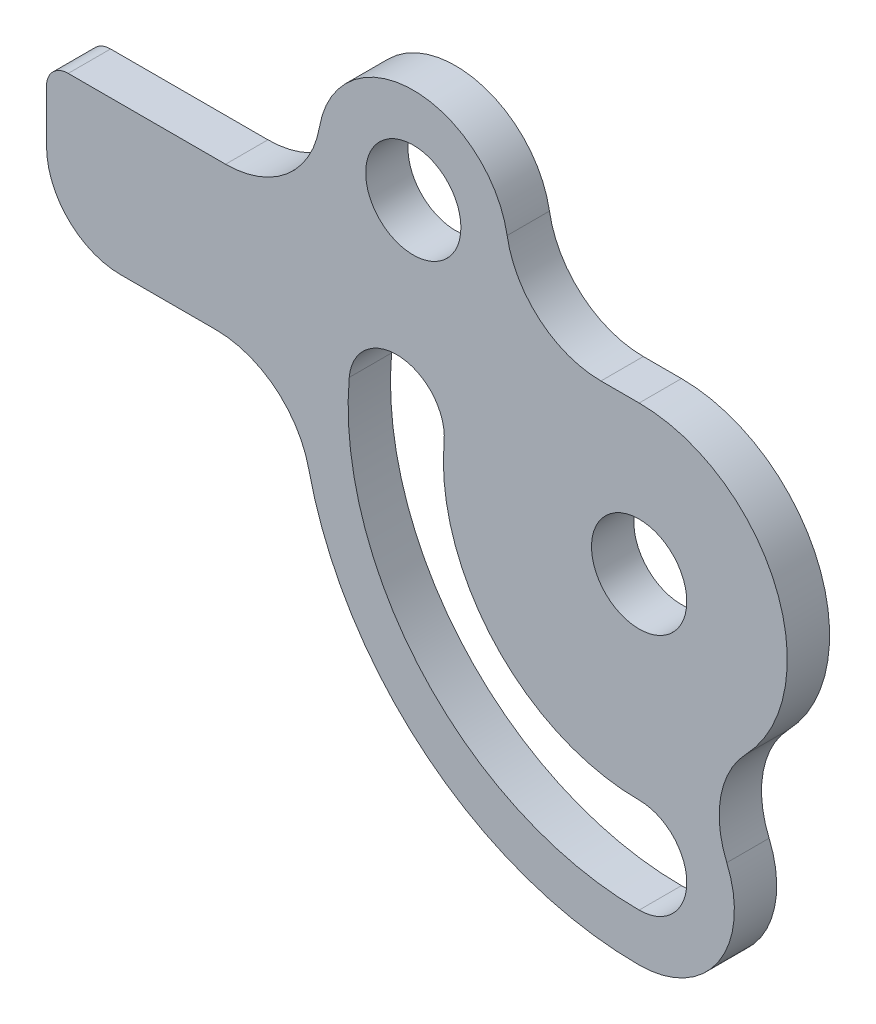
ISO-10303-21;
HEADER;
FILE_DESCRIPTION(('STEP AP214'),'2;1');
FILE_NAME('part.step','',(''),(''),'','','');
FILE_SCHEMA(('AUTOMOTIVE_DESIGN { 1 0 10303 214 1 1 1 1 }'));
ENDSEC;
DATA;
#1=APPLICATION_CONTEXT('core data for automotive mechanical design processes');
#2=APPLICATION_PROTOCOL_DEFINITION('international standard','automotive_design',2000,#1);
#3=PRODUCT_CONTEXT('',#1,'mechanical');
#4=PRODUCT('Part','Part','',(#3));
#5=PRODUCT_RELATED_PRODUCT_CATEGORY('part','',(#4));
#6=PRODUCT_DEFINITION_FORMATION('','',#4);
#7=PRODUCT_DEFINITION_CONTEXT('part definition',#1,'design');
#8=PRODUCT_DEFINITION('design','',#6,#7);
#9=PRODUCT_DEFINITION_SHAPE('','',#8);
#10=(LENGTH_UNIT() NAMED_UNIT(*) SI_UNIT(.MILLI.,.METRE.));
#11=(NAMED_UNIT(*) PLANE_ANGLE_UNIT() SI_UNIT($,.RADIAN.));
#12=(NAMED_UNIT(*) SI_UNIT($,.STERADIAN.) SOLID_ANGLE_UNIT());
#13=UNCERTAINTY_MEASURE_WITH_UNIT(LENGTH_MEASURE(1.E-05),#10,'distance_accuracy_value','');
#14=(GEOMETRIC_REPRESENTATION_CONTEXT(3) GLOBAL_UNCERTAINTY_ASSIGNED_CONTEXT((#13)) GLOBAL_UNIT_ASSIGNED_CONTEXT((#10,
#11,#12)) REPRESENTATION_CONTEXT('',''));
#15=CARTESIAN_POINT('',(0.,0.,0.));
#16=DIRECTION('',(0.,0.,1.));
#17=DIRECTION('',(1.,0.,0.));
#18=AXIS2_PLACEMENT_3D('',#15,#16,#17);
#19=CARTESIAN_POINT('',(22.225,0.,1.5875));
#20=DIRECTION('',(0.,0.,-1.));
#21=DIRECTION('',(-1.,0.,0.));
#22=AXIS2_PLACEMENT_3D('',#19,#20,#21);
#23=CYLINDRICAL_SURFACE('',#22,10.9140625);
#24=CARTESIAN_POINT('',(22.225,0.,0.));
#25=DIRECTION('',(0.,0.,1.));
#26=DIRECTION('',(1.,0.,0.));
#27=AXIS2_PLACEMENT_3D('',#24,#25,#26);
#28=CIRCLE('',#27,10.9140625);
#29=CARTESIAN_POINT('',(22.225,-10.9140625,0.));
#30=VERTEX_POINT('',#29);
#31=CARTESIAN_POINT('',(11.3524688028581,0.95122322358182,0.));
#32=VERTEX_POINT('',#31);
#33=EDGE_CURVE('E255',#30,#32,#28,.F.);
#34=ORIENTED_EDGE('',*,*,#33,.T.);
#35=DIRECTION('',(0.,0.,-1.));
#36=VECTOR('',#35,1.);
#37=CARTESIAN_POINT('',(11.3524688028581,0.95122322358182,1.5875));
#38=LINE('',#37,#36);
#39=CARTESIAN_POINT('',(11.3524688028581,0.95122322358182,1.5875));
#40=VERTEX_POINT('',#39);
#41=EDGE_CURVE('E274',#40,#32,#38,.T.);
#42=ORIENTED_EDGE('',*,*,#41,.F.);
#43=CARTESIAN_POINT('',(22.225,0.,1.5875));
#44=DIRECTION('',(0.,0.,1.));
#45=DIRECTION('',(1.,0.,0.));
#46=AXIS2_PLACEMENT_3D('',#43,#44,#45);
#47=CIRCLE('',#46,10.9140625);
#48=CARTESIAN_POINT('',(22.225,-10.9140625,1.5875));
#49=VERTEX_POINT('',#48);
#50=EDGE_CURVE('E215',#49,#40,#47,.F.);
#51=ORIENTED_EDGE('',*,*,#50,.F.);
#52=DIRECTION('',(0.,0.,-1.));
#53=VECTOR('',#52,1.);
#54=CARTESIAN_POINT('',(22.225,-10.9140625,1.5875));
#55=LINE('',#54,#53);
#56=EDGE_CURVE('E175',#49,#30,#55,.T.);
#57=ORIENTED_EDGE('',*,*,#56,.T.);
#58=EDGE_LOOP('',(#34,#42,#51,#57));
#59=FACE_BOUND('',#58,.T.);
#60=ADVANCED_FACE('F38',(#59),#23,.F.);
#61=CARTESIAN_POINT('',(13.1316102714813,0.795568514268432,1.5875));
#62=DIRECTION('',(0.,0.,-1.));
#63=DIRECTION('',(-1.,0.,0.));
#64=AXIS2_PLACEMENT_3D('',#61,#62,#63);
#65=CYLINDRICAL_SURFACE('',#64,1.7859375);
#66=CARTESIAN_POINT('',(13.1316102714813,0.795568514268432,0.));
#67=DIRECTION('',(0.,0.,1.));
#68=DIRECTION('',(1.,0.,0.));
#69=AXIS2_PLACEMENT_3D('',#66,#67,#68);
#70=CIRCLE('',#69,1.7859375);
#71=CARTESIAN_POINT('',(14.9107517401045,0.639913804955043,0.));
#72=VERTEX_POINT('',#71);
#73=EDGE_CURVE('E258',#72,#32,#70,.T.);
#74=ORIENTED_EDGE('',*,*,#73,.F.);
#75=DIRECTION('',(0.,0.,-1.));
#76=VECTOR('',#75,1.);
#77=CARTESIAN_POINT('',(14.9107517401045,0.639913804955043,1.5875));
#78=LINE('',#77,#76);
#79=CARTESIAN_POINT('',(14.9107517401045,0.639913804955043,1.5875));
#80=VERTEX_POINT('',#79);
#81=EDGE_CURVE('E272',#80,#72,#78,.T.);
#82=ORIENTED_EDGE('',*,*,#81,.F.);
#83=CARTESIAN_POINT('',(13.1316102714813,0.795568514268432,1.5875));
#84=DIRECTION('',(0.,0.,1.));
#85=DIRECTION('',(1.,0.,0.));
#86=AXIS2_PLACEMENT_3D('',#83,#84,#85);
#87=CIRCLE('',#86,1.7859375);
#88=EDGE_CURVE('E217',#80,#40,#87,.T.);
#89=ORIENTED_EDGE('',*,*,#88,.T.);
#90=ORIENTED_EDGE('',*,*,#41,.T.);
#91=EDGE_LOOP('',(#74,#82,#89,#90));
#92=FACE_BOUND('',#91,.T.);
#93=ADVANCED_FACE('F335',(#92),#65,.F.);
#94=CARTESIAN_POINT('',(22.225,0.,1.5875));
#95=DIRECTION('',(0.,0.,-1.));
#96=DIRECTION('',(-1.,0.,0.));
#97=AXIS2_PLACEMENT_3D('',#94,#95,#96);
#98=CYLINDRICAL_SURFACE('',#97,7.3421875);
#99=CARTESIAN_POINT('',(22.225,0.,0.));
#100=DIRECTION('',(0.,0.,1.));
#101=DIRECTION('',(1.,0.,0.));
#102=AXIS2_PLACEMENT_3D('',#99,#100,#101);
#103=CIRCLE('',#102,7.3421875);
#104=CARTESIAN_POINT('',(22.225,-7.3421875,0.));
#105=VERTEX_POINT('',#104);
#106=EDGE_CURVE('E261',#72,#105,#103,.T.);
#107=ORIENTED_EDGE('',*,*,#106,.T.);
#108=DIRECTION('',(0.,0.,-1.));
#109=VECTOR('',#108,1.);
#110=CARTESIAN_POINT('',(22.225,-7.3421875,1.5875));
#111=LINE('',#110,#109);
#112=CARTESIAN_POINT('',(22.225,-7.3421875,1.5875));
#113=VERTEX_POINT('',#112);
#114=EDGE_CURVE('E270',#113,#105,#111,.T.);
#115=ORIENTED_EDGE('',*,*,#114,.F.);
#116=CARTESIAN_POINT('',(22.225,0.,1.5875));
#117=DIRECTION('',(0.,0.,1.));
#118=DIRECTION('',(1.,0.,0.));
#119=AXIS2_PLACEMENT_3D('',#116,#117,#118);
#120=CIRCLE('',#119,7.3421875);
#121=EDGE_CURVE('E220',#80,#113,#120,.T.);
#122=ORIENTED_EDGE('',*,*,#121,.F.);
#123=ORIENTED_EDGE('',*,*,#81,.T.);
#124=EDGE_LOOP('',(#107,#115,#122,#123));
#125=FACE_BOUND('',#124,.T.);
#126=ADVANCED_FACE('F341',(#125),#98,.T.);
#127=CARTESIAN_POINT('',(0.,5.55625,1.5875));
#128=DIRECTION('',(0.,1.,0.));
#129=DIRECTION('',(0.,0.,1.));
#130=AXIS2_PLACEMENT_3D('',#127,#128,#129);
#131=PLANE('',#130);
#132=DIRECTION('',(1.,0.,0.));
#133=VECTOR('',#132,1.);
#134=CARTESIAN_POINT('',(0.,5.55625,1.5875));
#135=LINE('',#134,#133);
#136=CARTESIAN_POINT('',(0.813693973516123,5.55625,1.5875));
#137=VERTEX_POINT('',#136);
#138=CARTESIAN_POINT('',(6.71473119369293,5.55625,1.5875));
#139=VERTEX_POINT('',#138);
#140=EDGE_CURVE('E168',#137,#139,#135,.T.);
#141=ORIENTED_EDGE('',*,*,#140,.T.);
#142=DIRECTION('',(0.,0.,-1.));
#143=VECTOR('',#142,1.);
#144=CARTESIAN_POINT('',(6.71473119369293,5.55625,1.5875));
#145=LINE('',#144,#143);
#146=CARTESIAN_POINT('',(6.71473119369293,5.55625,0.));
#147=VERTEX_POINT('',#146);
#148=EDGE_CURVE('E298',#139,#147,#145,.T.);
#149=ORIENTED_EDGE('',*,*,#148,.T.);
#150=DIRECTION('',(1.,0.,0.));
#151=VECTOR('',#150,1.);
#152=CARTESIAN_POINT('',(0.,5.55625,0.));
#153=LINE('',#152,#151);
#154=CARTESIAN_POINT('',(0.813693973516123,5.55625,0.));
#155=VERTEX_POINT('',#154);
#156=EDGE_CURVE('E171',#155,#147,#153,.T.);
#157=ORIENTED_EDGE('',*,*,#156,.F.);
#158=DIRECTION('',(0.,0.,-1.));
#159=VECTOR('',#158,1.);
#160=CARTESIAN_POINT('',(0.813693973516123,5.55625,1.5875));
#161=LINE('',#160,#159);
#162=EDGE_CURVE('E163',#137,#155,#161,.T.);
#163=ORIENTED_EDGE('',*,*,#162,.F.);
#164=EDGE_LOOP('',(#141,#149,#157,#163));
#165=FACE_BOUND('',#164,.T.);
#166=ADVANCED_FACE('F165',(#165),#131,.T.);
#167=CARTESIAN_POINT('',(0.813693973516123,4.74255602648388,1.5875));
#168=DIRECTION('',(0.,0.,-1.));
#169=DIRECTION('',(-1.,0.,0.));
#170=AXIS2_PLACEMENT_3D('',#167,#168,#169);
#171=CYLINDRICAL_SURFACE('',#170,0.813693973516123);
#172=CARTESIAN_POINT('',(0.813693973516123,4.74255602648388,0.));
#173=DIRECTION('',(0.,0.,1.));
#174=DIRECTION('',(1.,0.,0.));
#175=AXIS2_PLACEMENT_3D('',#172,#173,#174);
#176=CIRCLE('',#175,0.813693973516123);
#177=CARTESIAN_POINT('',(0.,4.74255602648388,0.));
#178=VERTEX_POINT('',#177);
#179=EDGE_CURVE('E233',#155,#178,#176,.T.);
#180=ORIENTED_EDGE('',*,*,#179,.T.);
#181=DIRECTION('',(0.,0.,-1.));
#182=VECTOR('',#181,1.);
#183=CARTESIAN_POINT('',(0.,4.74255602648388,1.5875));
#184=LINE('',#183,#182);
#185=CARTESIAN_POINT('',(0.,4.74255602648388,1.5875));
#186=VERTEX_POINT('',#185);
#187=EDGE_CURVE('E176',#186,#178,#184,.T.);
#188=ORIENTED_EDGE('',*,*,#187,.F.);
#189=CARTESIAN_POINT('',(0.813693973516123,4.74255602648388,1.5875));
#190=DIRECTION('',(0.,0.,1.));
#191=DIRECTION('',(1.,0.,0.));
#192=AXIS2_PLACEMENT_3D('',#189,#190,#191);
#193=CIRCLE('',#192,0.813693973516123);
#194=EDGE_CURVE('E179',#137,#186,#193,.T.);
#195=ORIENTED_EDGE('',*,*,#194,.F.);
#196=ORIENTED_EDGE('',*,*,#162,.T.);
#197=EDGE_LOOP('',(#180,#188,#195,#196));
#198=FACE_BOUND('',#197,.T.);
#199=ADVANCED_FACE('F180',(#198),#171,.T.);
#200=CARTESIAN_POINT('',(0.,0.,1.5875));
#201=DIRECTION('',(-1.,0.,0.));
#202=DIRECTION('',(0.,0.,1.));
#203=AXIS2_PLACEMENT_3D('',#200,#201,#202);
#204=PLANE('',#203);
#205=DIRECTION('',(0.,1.,0.));
#206=VECTOR('',#205,1.);
#207=CARTESIAN_POINT('',(0.,0.,0.));
#208=LINE('',#207,#206);
#209=CARTESIAN_POINT('',(0.,2.778125,0.));
#210=VERTEX_POINT('',#209);
#211=EDGE_CURVE('E235',#210,#178,#208,.T.);
#212=ORIENTED_EDGE('',*,*,#211,.F.);
#213=DIRECTION('',(0.,0.,-1.));
#214=VECTOR('',#213,1.);
#215=CARTESIAN_POINT('',(0.,2.778125,1.5875));
#216=LINE('',#215,#214);
#217=CARTESIAN_POINT('',(0.,2.778125,1.5875));
#218=VERTEX_POINT('',#217);
#219=EDGE_CURVE('E284',#218,#210,#216,.T.);
#220=ORIENTED_EDGE('',*,*,#219,.F.);
#221=DIRECTION('',(0.,1.,0.));
#222=VECTOR('',#221,1.);
#223=CARTESIAN_POINT('',(0.,0.,1.5875));
#224=LINE('',#223,#222);
#225=EDGE_CURVE('E184',#218,#186,#224,.T.);
#226=ORIENTED_EDGE('',*,*,#225,.T.);
#227=ORIENTED_EDGE('',*,*,#187,.T.);
#228=EDGE_LOOP('',(#212,#220,#226,#227));
#229=FACE_BOUND('',#228,.T.);
#230=ADVANCED_FACE('F373',(#229),#204,.T.);
#231=CARTESIAN_POINT('',(2.778125,2.778125,1.5875));
#232=DIRECTION('',(0.,0.,-1.));
#233=DIRECTION('',(-1.,0.,0.));
#234=AXIS2_PLACEMENT_3D('',#231,#232,#233);
#235=CYLINDRICAL_SURFACE('',#234,2.778125);
#236=CARTESIAN_POINT('',(2.778125,2.778125,0.));
#237=DIRECTION('',(0.,0.,1.));
#238=DIRECTION('',(1.,0.,0.));
#239=AXIS2_PLACEMENT_3D('',#236,#237,#238);
#240=CIRCLE('',#239,2.778125);
#241=CARTESIAN_POINT('',(2.778125,0.,0.));
#242=VERTEX_POINT('',#241);
#243=EDGE_CURVE('E238',#210,#242,#240,.T.);
#244=ORIENTED_EDGE('',*,*,#243,.T.);
#245=DIRECTION('',(0.,0.,-1.));
#246=VECTOR('',#245,1.);
#247=CARTESIAN_POINT('',(2.778125,0.,1.5875));
#248=LINE('',#247,#246);
#249=CARTESIAN_POINT('',(2.778125,0.,1.5875));
#250=VERTEX_POINT('',#249);
#251=EDGE_CURVE('E281',#250,#242,#248,.T.);
#252=ORIENTED_EDGE('',*,*,#251,.F.);
#253=CARTESIAN_POINT('',(2.778125,2.778125,1.5875));
#254=DIRECTION('',(0.,0.,1.));
#255=DIRECTION('',(1.,0.,0.));
#256=AXIS2_PLACEMENT_3D('',#253,#254,#255);
#257=CIRCLE('',#256,2.778125);
#258=EDGE_CURVE('E198',#218,#250,#257,.T.);
#259=ORIENTED_EDGE('',*,*,#258,.F.);
#260=ORIENTED_EDGE('',*,*,#219,.T.);
#261=EDGE_LOOP('',(#244,#252,#259,#260));
#262=FACE_BOUND('',#261,.T.);
#263=ADVANCED_FACE('F370',(#262),#235,.T.);
#264=CARTESIAN_POINT('',(0.,0.,1.5875));
#265=DIRECTION('',(0.,1.,0.));
#266=DIRECTION('',(0.,0.,1.));
#267=AXIS2_PLACEMENT_3D('',#264,#265,#266);
#268=PLANE('',#267);
#269=DIRECTION('',(1.,0.,0.));
#270=VECTOR('',#269,1.);
#271=CARTESIAN_POINT('',(0.,0.,0.));
#272=LINE('',#271,#270);
#273=CARTESIAN_POINT('',(6.35,0.,0.));
#274=VERTEX_POINT('',#273);
#275=EDGE_CURVE('E240',#242,#274,#272,.T.);
#276=ORIENTED_EDGE('',*,*,#275,.T.);
#277=DIRECTION('',(0.,0.,-1.));
#278=VECTOR('',#277,1.);
#279=CARTESIAN_POINT('',(6.35,0.,1.5875));
#280=LINE('',#279,#278);
#281=CARTESIAN_POINT('',(6.35,0.,1.5875));
#282=VERTEX_POINT('',#281);
#283=EDGE_CURVE('E53',#274,#282,#280,.F.);
#284=ORIENTED_EDGE('',*,*,#283,.T.);
#285=DIRECTION('',(1.,0.,0.));
#286=VECTOR('',#285,1.);
#287=CARTESIAN_POINT('',(0.,0.,1.5875));
#288=LINE('',#287,#286);
#289=EDGE_CURVE('E200',#250,#282,#288,.T.);
#290=ORIENTED_EDGE('',*,*,#289,.F.);
#291=ORIENTED_EDGE('',*,*,#251,.T.);
#292=EDGE_LOOP('',(#276,#284,#290,#291));
#293=FACE_BOUND('',#292,.T.);
#294=ADVANCED_FACE('F366',(#293),#268,.F.);
#295=CARTESIAN_POINT('',(22.225,0.,1.5875));
#296=DIRECTION('',(0.,0.,-1.));
#297=DIRECTION('',(-1.,0.,0.));
#298=AXIS2_PLACEMENT_3D('',#295,#296,#297);
#299=CYLINDRICAL_SURFACE('',#298,12.7);
#300=CARTESIAN_POINT('',(22.225,0.,1.5875));
#301=DIRECTION('',(0.,0.,1.));
#302=DIRECTION('',(1.,0.,0.));
#303=AXIS2_PLACEMENT_3D('',#300,#301,#302);
#304=CIRCLE('',#303,12.7);
#305=CARTESIAN_POINT('',(22.225,-12.7,1.5875));
#306=VERTEX_POINT('',#305);
#307=CARTESIAN_POINT('',(9.83475609756098,-2.78780487804878,1.5875));
#308=VERTEX_POINT('',#307);
#309=EDGE_CURVE('E202',#306,#308,#304,.F.);
#310=ORIENTED_EDGE('',*,*,#309,.T.);
#311=DIRECTION('',(0.,0.,-1.));
#312=VECTOR('',#311,1.);
#313=CARTESIAN_POINT('',(9.83475609756098,-2.78780487804878,1.5875));
#314=LINE('',#313,#312);
#315=CARTESIAN_POINT('',(9.83475609756098,-2.78780487804878,0.));
#316=VERTEX_POINT('',#315);
#317=EDGE_CURVE('E300',#308,#316,#314,.T.);
#318=ORIENTED_EDGE('',*,*,#317,.T.);
#319=CARTESIAN_POINT('',(22.225,0.,0.));
#320=DIRECTION('',(0.,0.,1.));
#321=DIRECTION('',(1.,0.,0.));
#322=AXIS2_PLACEMENT_3D('',#319,#320,#321);
#323=CIRCLE('',#322,12.7);
#324=CARTESIAN_POINT('',(22.225,-12.7,0.));
#325=VERTEX_POINT('',#324);
#326=EDGE_CURVE('E242',#325,#316,#323,.F.);
#327=ORIENTED_EDGE('',*,*,#326,.F.);
#328=DIRECTION('',(0.,0.,-1.));
#329=VECTOR('',#328,1.);
#330=CARTESIAN_POINT('',(22.225,-12.7,1.5875));
#331=LINE('',#330,#329);
#332=EDGE_CURVE('E279',#306,#325,#331,.T.);
#333=ORIENTED_EDGE('',*,*,#332,.F.);
#334=EDGE_LOOP('',(#310,#318,#327,#333));
#335=FACE_BOUND('',#334,.T.);
#336=ADVANCED_FACE('F362',(#335),#299,.T.);
#337=CARTESIAN_POINT('',(22.225,-9.128125,1.5875));
#338=DIRECTION('',(0.,0.,-1.));
#339=DIRECTION('',(-1.,0.,0.));
#340=AXIS2_PLACEMENT_3D('',#337,#338,#339);
#341=CYLINDRICAL_SURFACE('',#340,3.571875);
#342=CARTESIAN_POINT('',(22.225,-9.128125,0.));
#343=DIRECTION('',(0.,0.,1.));
#344=DIRECTION('',(1.,0.,0.));
#345=AXIS2_PLACEMENT_3D('',#342,#343,#344);
#346=CIRCLE('',#345,3.571875);
#347=CARTESIAN_POINT('',(25.5120584223335,-7.7304347826087,0.));
#348=VERTEX_POINT('',#347);
#349=EDGE_CURVE('E244',#325,#348,#346,.T.);
#350=ORIENTED_EDGE('',*,*,#349,.T.);
#351=DIRECTION('',(0.,0.,-1.));
#352=VECTOR('',#351,1.);
#353=CARTESIAN_POINT('',(25.5120584223335,-7.73043478260869,1.5875));
#354=LINE('',#353,#352);
#355=CARTESIAN_POINT('',(25.5120584223335,-7.7304347826087,1.5875));
#356=VERTEX_POINT('',#355);
#357=EDGE_CURVE('E289',#348,#356,#354,.F.);
#358=ORIENTED_EDGE('',*,*,#357,.T.);
#359=CARTESIAN_POINT('',(22.225,-9.128125,1.5875));
#360=DIRECTION('',(0.,0.,1.));
#361=DIRECTION('',(1.,0.,0.));
#362=AXIS2_PLACEMENT_3D('',#359,#360,#361);
#363=CIRCLE('',#362,3.571875);
#364=EDGE_CURVE('E205',#306,#356,#363,.T.);
#365=ORIENTED_EDGE('',*,*,#364,.F.);
#366=ORIENTED_EDGE('',*,*,#332,.T.);
#367=EDGE_LOOP('',(#350,#358,#365,#366));
#368=FACE_BOUND('',#367,.T.);
#369=ADVANCED_FACE('F358',(#368),#341,.T.);
#370=CARTESIAN_POINT('',(22.225,0.,1.5875));
#371=DIRECTION('',(0.,0.,-1.));
#372=DIRECTION('',(-1.,0.,0.));
#373=AXIS2_PLACEMENT_3D('',#370,#371,#372);
#374=CYLINDRICAL_SURFACE('',#373,5.55625);
#375=CARTESIAN_POINT('',(22.225,0.,1.5875));
#376=DIRECTION('',(0.,0.,1.));
#377=DIRECTION('',(1.,0.,0.));
#378=AXIS2_PLACEMENT_3D('',#375,#376,#377);
#379=CIRCLE('',#378,5.55625);
#380=CARTESIAN_POINT('',(26.2266363402321,-3.8547140831758,1.5875));
#381=VERTEX_POINT('',#380);
#382=CARTESIAN_POINT('',(22.225,5.55625,1.5875));
#383=VERTEX_POINT('',#382);
#384=EDGE_CURVE('E208',#381,#383,#379,.T.);
#385=ORIENTED_EDGE('',*,*,#384,.F.);
#386=DIRECTION('',(0.,0.,-1.));
#387=VECTOR('',#386,1.);
#388=CARTESIAN_POINT('',(26.2266363402321,-3.8547140831758,1.5875));
#389=LINE('',#388,#387);
#390=CARTESIAN_POINT('',(26.2266363402321,-3.8547140831758,0.));
#391=VERTEX_POINT('',#390);
#392=EDGE_CURVE('E276',#381,#391,#389,.T.);
#393=ORIENTED_EDGE('',*,*,#392,.T.);
#394=CARTESIAN_POINT('',(22.225,0.,0.));
#395=DIRECTION('',(0.,0.,1.));
#396=DIRECTION('',(1.,0.,0.));
#397=AXIS2_PLACEMENT_3D('',#394,#395,#396);
#398=CIRCLE('',#397,5.55625);
#399=CARTESIAN_POINT('',(22.225,5.55625,0.));
#400=VERTEX_POINT('',#399);
#401=EDGE_CURVE('E247',#391,#400,#398,.T.);
#402=ORIENTED_EDGE('',*,*,#401,.T.);
#403=DIRECTION('',(0.,0.,-1.));
#404=VECTOR('',#403,1.);
#405=CARTESIAN_POINT('',(22.225,5.55625,1.5875));
#406=LINE('',#405,#404);
#407=EDGE_CURVE('E231',#383,#400,#406,.T.);
#408=ORIENTED_EDGE('',*,*,#407,.F.);
#409=EDGE_LOOP('',(#385,#393,#402,#408));
#410=FACE_BOUND('',#409,.T.);
#411=ADVANCED_FACE('F354',(#410),#374,.T.);
#412=CARTESIAN_POINT('',(0.,5.55625,1.5875));
#413=DIRECTION('',(0.,1.,0.));
#414=DIRECTION('',(0.,0.,1.));
#415=AXIS2_PLACEMENT_3D('',#412,#413,#414);
#416=PLANE('',#415);
#417=DIRECTION('',(1.,0.,0.));
#418=VECTOR('',#417,1.);
#419=CARTESIAN_POINT('',(0.,5.55625,0.));
#420=LINE('',#419,#418);
#421=CARTESIAN_POINT('',(20.7937270237767,5.55625,0.));
#422=VERTEX_POINT('',#421);
#423=EDGE_CURVE('E250',#422,#400,#420,.T.);
#424=ORIENTED_EDGE('',*,*,#423,.F.);
#425=DIRECTION('',(0.,0.,-1.));
#426=VECTOR('',#425,1.);
#427=CARTESIAN_POINT('',(20.7937270237767,5.55625,1.5875));
#428=LINE('',#427,#426);
#429=CARTESIAN_POINT('',(20.7937270237767,5.55625,1.5875));
#430=VERTEX_POINT('',#429);
#431=EDGE_CURVE('E296',#422,#430,#428,.F.);
#432=ORIENTED_EDGE('',*,*,#431,.T.);
#433=DIRECTION('',(1.,0.,0.));
#434=VECTOR('',#433,1.);
#435=CARTESIAN_POINT('',(0.,5.55625,1.5875));
#436=LINE('',#435,#434);
#437=EDGE_CURVE('E211',#430,#383,#436,.T.);
#438=ORIENTED_EDGE('',*,*,#437,.T.);
#439=ORIENTED_EDGE('',*,*,#407,.T.);
#440=EDGE_LOOP('',(#424,#432,#438,#439));
#441=FACE_BOUND('',#440,.T.);
#442=ADVANCED_FACE('F350',(#441),#416,.T.);
#443=CARTESIAN_POINT('',(22.225,0.,1.5875));
#444=DIRECTION('',(0.,0.,-1.));
#445=DIRECTION('',(-1.,0.,0.));
#446=AXIS2_PLACEMENT_3D('',#443,#444,#445);
#447=CYLINDRICAL_SURFACE('',#446,1.7859375);
#448=CARTESIAN_POINT('',(22.225,0.,1.5875));
#449=DIRECTION('',(0.,0.,1.));
#450=DIRECTION('',(1.,0.,0.));
#451=AXIS2_PLACEMENT_3D('',#448,#449,#450);
#452=CIRCLE('',#451,1.7859375);
#453=CARTESIAN_POINT('',(24.0109375,0.,1.5875));
#454=VERTEX_POINT('',#453);
#455=EDGE_CURVE('E225',#454,#454,#452,.T.);
#456=ORIENTED_EDGE('',*,*,#455,.T.);
#457=EDGE_LOOP('',(#456));
#458=FACE_BOUND('',#457,.T.);
#459=CARTESIAN_POINT('',(22.225,0.,0.));
#460=DIRECTION('',(0.,0.,1.));
#461=DIRECTION('',(1.,0.,0.));
#462=AXIS2_PLACEMENT_3D('',#459,#460,#461);
#463=CIRCLE('',#462,1.7859375);
#464=CARTESIAN_POINT('',(24.0109375,0.,0.));
#465=VERTEX_POINT('',#464);
#466=EDGE_CURVE('E194',#465,#465,#463,.T.);
#467=ORIENTED_EDGE('',*,*,#466,.F.);
#468=EDGE_LOOP('',(#467));
#469=FACE_BOUND('',#468,.T.);
#470=ADVANCED_FACE('F353',(#458,#469),#447,.F.);
#471=CARTESIAN_POINT('',(22.225,-9.128125,1.5875));
#472=DIRECTION('',(0.,0.,-1.));
#473=DIRECTION('',(-1.,0.,0.));
#474=AXIS2_PLACEMENT_3D('',#471,#472,#473);
#475=CYLINDRICAL_SURFACE('',#474,1.7859375);
#476=CARTESIAN_POINT('',(22.225,-9.128125,0.));
#477=DIRECTION('',(0.,0.,1.));
#478=DIRECTION('',(1.,0.,0.));
#479=AXIS2_PLACEMENT_3D('',#476,#477,#478);
#480=CIRCLE('',#479,1.7859375);
#481=EDGE_CURVE('E264',#30,#105,#480,.T.);
#482=ORIENTED_EDGE('',*,*,#481,.F.);
#483=ORIENTED_EDGE('',*,*,#56,.F.);
#484=CARTESIAN_POINT('',(22.225,-9.128125,1.5875));
#485=DIRECTION('',(0.,0.,1.));
#486=DIRECTION('',(1.,0.,0.));
#487=AXIS2_PLACEMENT_3D('',#484,#485,#486);
#488=CIRCLE('',#487,1.7859375);
#489=EDGE_CURVE('E222',#49,#113,#488,.T.);
#490=ORIENTED_EDGE('',*,*,#489,.T.);
#491=ORIENTED_EDGE('',*,*,#114,.T.);
#492=EDGE_LOOP('',(#482,#483,#490,#491));
#493=FACE_BOUND('',#492,.T.);
#494=ADVANCED_FACE('F349',(#493),#475,.F.);
#495=CARTESIAN_POINT('',(13.7542291087348,7.91213438876134,1.5875));
#496=DIRECTION('',(0.,0.,-1.));
#497=DIRECTION('',(-1.,0.,0.));
#498=AXIS2_PLACEMENT_3D('',#495,#496,#497);
#499=CYLINDRICAL_SURFACE('',#498,3.571875);
#500=CARTESIAN_POINT('',(13.7542291087348,7.91213438876134,1.5875));
#501=DIRECTION('',(0.,0.,1.));
#502=DIRECTION('',(1.,0.,0.));
#503=AXIS2_PLACEMENT_3D('',#500,#501,#502);
#504=CIRCLE('',#503,3.571875);
#505=CARTESIAN_POINT('',(17.2739780662558,8.52012969438067,1.5875));
#506=VERTEX_POINT('',#505);
#507=CARTESIAN_POINT('',(10.2344801512139,8.52012969438067,1.5875));
#508=VERTEX_POINT('',#507);
#509=EDGE_CURVE('E213',#506,#508,#504,.T.);
#510=ORIENTED_EDGE('',*,*,#509,.F.);
#511=DIRECTION('',(0.,0.,-1.));
#512=VECTOR('',#511,1.);
#513=CARTESIAN_POINT('',(17.2739780662558,8.52012969438067,1.5875));
#514=LINE('',#513,#512);
#515=CARTESIAN_POINT('',(17.2739780662558,8.52012969438067,0.));
#516=VERTEX_POINT('',#515);
#517=EDGE_CURVE('E293',#506,#516,#514,.T.);
#518=ORIENTED_EDGE('',*,*,#517,.T.);
#519=CARTESIAN_POINT('',(13.7542291087348,7.91213438876134,0.));
#520=DIRECTION('',(0.,0.,1.));
#521=DIRECTION('',(1.,0.,0.));
#522=AXIS2_PLACEMENT_3D('',#519,#520,#521);
#523=CIRCLE('',#522,3.571875);
#524=CARTESIAN_POINT('',(10.2344801512139,8.52012969438067,0.));
#525=VERTEX_POINT('',#524);
#526=EDGE_CURVE('E252',#516,#525,#523,.T.);
#527=ORIENTED_EDGE('',*,*,#526,.T.);
#528=DIRECTION('',(0.,0.,-1.));
#529=VECTOR('',#528,1.);
#530=CARTESIAN_POINT('',(10.2344801512139,8.52012969438067,1.5875));
#531=LINE('',#530,#529);
#532=EDGE_CURVE('E291',#525,#508,#531,.F.);
#533=ORIENTED_EDGE('',*,*,#532,.T.);
#534=EDGE_LOOP('',(#510,#518,#527,#533));
#535=FACE_BOUND('',#534,.T.);
#536=ADVANCED_FACE('F321',(#535),#499,.T.);
#537=CARTESIAN_POINT('',(13.7542291087348,7.91213438876134,1.5875));
#538=DIRECTION('',(0.,0.,-1.));
#539=DIRECTION('',(-1.,0.,0.));
#540=AXIS2_PLACEMENT_3D('',#537,#538,#539);
#541=CYLINDRICAL_SURFACE('',#540,1.7859375);
#542=CARTESIAN_POINT('',(13.7542291087348,7.91213438876134,1.5875));
#543=DIRECTION('',(0.,0.,1.));
#544=DIRECTION('',(1.,0.,0.));
#545=AXIS2_PLACEMENT_3D('',#542,#543,#544);
#546=CIRCLE('',#545,1.7859375);
#547=CARTESIAN_POINT('',(15.5401666087348,7.91213438876134,1.5875));
#548=VERTEX_POINT('',#547);
#549=EDGE_CURVE('E228',#548,#548,#546,.T.);
#550=ORIENTED_EDGE('',*,*,#549,.T.);
#551=EDGE_LOOP('',(#550));
#552=FACE_BOUND('',#551,.T.);
#553=CARTESIAN_POINT('',(13.7542291087348,7.91213438876134,0.));
#554=DIRECTION('',(0.,0.,1.));
#555=DIRECTION('',(1.,0.,0.));
#556=AXIS2_PLACEMENT_3D('',#553,#554,#555);
#557=CIRCLE('',#556,1.7859375);
#558=CARTESIAN_POINT('',(15.5401666087348,7.91213438876134,0.));
#559=VERTEX_POINT('',#558);
#560=EDGE_CURVE('E191',#559,#559,#557,.T.);
#561=ORIENTED_EDGE('',*,*,#560,.F.);
#562=EDGE_LOOP('',(#561));
#563=FACE_BOUND('',#562,.T.);
#564=ADVANCED_FACE('F348',(#552,#563),#541,.F.);
#565=CARTESIAN_POINT('',(0.,0.,1.5875));
#566=DIRECTION('',(0.,0.,1.));
#567=DIRECTION('',(1.,0.,0.));
#568=AXIS2_PLACEMENT_3D('',#565,#566,#567);
#569=PLANE('',#568);
#570=ORIENTED_EDGE('',*,*,#140,.F.);
#571=ORIENTED_EDGE('',*,*,#194,.T.);
#572=ORIENTED_EDGE('',*,*,#225,.F.);
#573=ORIENTED_EDGE('',*,*,#258,.T.);
#574=ORIENTED_EDGE('',*,*,#289,.T.);
#575=CARTESIAN_POINT('',(6.35,-3.571875,1.5875));
#576=DIRECTION('',(0.,0.,1.));
#577=DIRECTION('',(1.,0.,0.));
#578=AXIS2_PLACEMENT_3D('',#575,#576,#577);
#579=CIRCLE('',#578,3.571875);
#580=EDGE_CURVE('E11',#282,#308,#579,.F.);
#581=ORIENTED_EDGE('',*,*,#580,.T.);
#582=ORIENTED_EDGE('',*,*,#309,.F.);
#583=ORIENTED_EDGE('',*,*,#364,.T.);
#584=CARTESIAN_POINT('',(28.799116844667,-6.33274456521739,1.5875));
#585=DIRECTION('',(0.,0.,1.));
#586=DIRECTION('',(1.,0.,0.));
#587=AXIS2_PLACEMENT_3D('',#584,#585,#586);
#588=CIRCLE('',#587,3.571875);
#589=EDGE_CURVE('E306',#356,#381,#588,.F.);
#590=ORIENTED_EDGE('',*,*,#589,.T.);
#591=ORIENTED_EDGE('',*,*,#384,.T.);
#592=ORIENTED_EDGE('',*,*,#437,.F.);
#593=CARTESIAN_POINT('',(20.7937270237767,9.128125,1.5875));
#594=DIRECTION('',(0.,0.,1.));
#595=DIRECTION('',(1.,0.,0.));
#596=AXIS2_PLACEMENT_3D('',#593,#594,#595);
#597=CIRCLE('',#596,3.571875);
#598=EDGE_CURVE('E310',#430,#506,#597,.F.);
#599=ORIENTED_EDGE('',*,*,#598,.T.);
#600=ORIENTED_EDGE('',*,*,#509,.T.);
#601=CARTESIAN_POINT('',(6.71473119369293,9.128125,1.5875));
#602=DIRECTION('',(0.,0.,1.));
#603=DIRECTION('',(1.,0.,0.));
#604=AXIS2_PLACEMENT_3D('',#601,#602,#603);
#605=CIRCLE('',#604,3.571875);
#606=EDGE_CURVE('E190',#508,#139,#605,.F.);
#607=ORIENTED_EDGE('',*,*,#606,.T.);
#608=EDGE_LOOP('',(#570,#571,#572,#573,#574,#581,#582,#583,#590,#591,#592,#599,#600,#607));
#609=FACE_BOUND('',#608,.T.);
#610=ORIENTED_EDGE('',*,*,#50,.T.);
#611=ORIENTED_EDGE('',*,*,#88,.F.);
#612=ORIENTED_EDGE('',*,*,#121,.T.);
#613=ORIENTED_EDGE('',*,*,#489,.F.);
#614=EDGE_LOOP('',(#610,#611,#612,#613));
#615=FACE_BOUND('',#614,.T.);
#616=ORIENTED_EDGE('',*,*,#455,.F.);
#617=EDGE_LOOP('',(#616));
#618=FACE_BOUND('',#617,.T.);
#619=ORIENTED_EDGE('',*,*,#549,.F.);
#620=EDGE_LOOP('',(#619));
#621=FACE_BOUND('',#620,.T.);
#622=ADVANCED_FACE('F186',(#609,#615,#618,#621),#569,.T.);
#623=CARTESIAN_POINT('',(0.,0.,0.));
#624=DIRECTION('',(0.,0.,1.));
#625=DIRECTION('',(1.,0.,0.));
#626=AXIS2_PLACEMENT_3D('',#623,#624,#625);
#627=PLANE('',#626);
#628=ORIENTED_EDGE('',*,*,#156,.T.);
#629=CARTESIAN_POINT('',(6.71473119369293,9.128125,0.));
#630=DIRECTION('',(0.,0.,1.));
#631=DIRECTION('',(1.,0.,0.));
#632=AXIS2_PLACEMENT_3D('',#629,#630,#631);
#633=CIRCLE('',#632,3.571875);
#634=EDGE_CURVE('E312',#147,#525,#633,.T.);
#635=ORIENTED_EDGE('',*,*,#634,.T.);
#636=ORIENTED_EDGE('',*,*,#526,.F.);
#637=CARTESIAN_POINT('',(20.7937270237767,9.128125,0.));
#638=DIRECTION('',(0.,0.,1.));
#639=DIRECTION('',(1.,0.,0.));
#640=AXIS2_PLACEMENT_3D('',#637,#638,#639);
#641=CIRCLE('',#640,3.571875);
#642=EDGE_CURVE('E308',#516,#422,#641,.T.);
#643=ORIENTED_EDGE('',*,*,#642,.T.);
#644=ORIENTED_EDGE('',*,*,#423,.T.);
#645=ORIENTED_EDGE('',*,*,#401,.F.);
#646=CARTESIAN_POINT('',(28.799116844667,-6.33274456521739,0.));
#647=DIRECTION('',(0.,0.,1.));
#648=DIRECTION('',(1.,0.,0.));
#649=AXIS2_PLACEMENT_3D('',#646,#647,#648);
#650=CIRCLE('',#649,3.571875);
#651=EDGE_CURVE('E304',#391,#348,#650,.T.);
#652=ORIENTED_EDGE('',*,*,#651,.T.);
#653=ORIENTED_EDGE('',*,*,#349,.F.);
#654=ORIENTED_EDGE('',*,*,#326,.T.);
#655=CARTESIAN_POINT('',(6.35,-3.571875,0.));
#656=DIRECTION('',(0.,0.,1.));
#657=DIRECTION('',(1.,0.,0.));
#658=AXIS2_PLACEMENT_3D('',#655,#656,#657);
#659=CIRCLE('',#658,3.571875);
#660=EDGE_CURVE('E46',#316,#274,#659,.T.);
#661=ORIENTED_EDGE('',*,*,#660,.T.);
#662=ORIENTED_EDGE('',*,*,#275,.F.);
#663=ORIENTED_EDGE('',*,*,#243,.F.);
#664=ORIENTED_EDGE('',*,*,#211,.T.);
#665=ORIENTED_EDGE('',*,*,#179,.F.);
#666=EDGE_LOOP('',(#628,#635,#636,#643,#644,#645,#652,#653,#654,#661,#662,#663,#664,#665));
#667=FACE_BOUND('',#666,.T.);
#668=ORIENTED_EDGE('',*,*,#33,.F.);
#669=ORIENTED_EDGE('',*,*,#481,.T.);
#670=ORIENTED_EDGE('',*,*,#106,.F.);
#671=ORIENTED_EDGE('',*,*,#73,.T.);
#672=EDGE_LOOP('',(#668,#669,#670,#671));
#673=FACE_BOUND('',#672,.T.);
#674=ORIENTED_EDGE('',*,*,#466,.T.);
#675=EDGE_LOOP('',(#674));
#676=FACE_BOUND('',#675,.T.);
#677=ORIENTED_EDGE('',*,*,#560,.T.);
#678=EDGE_LOOP('',(#677));
#679=FACE_BOUND('',#678,.T.);
#680=ADVANCED_FACE('F315',(#667,#673,#676,#679),#627,.F.);
#681=CARTESIAN_POINT('',(28.799116844667,-6.33274456521739,1.5875));
#682=DIRECTION('',(0.,0.,1.));
#683=DIRECTION('',(1.,0.,0.));
#684=AXIS2_PLACEMENT_3D('',#681,#682,#683);
#685=CYLINDRICAL_SURFACE('',#684,3.571875);
#686=ORIENTED_EDGE('',*,*,#589,.F.);
#687=ORIENTED_EDGE('',*,*,#357,.F.);
#688=ORIENTED_EDGE('',*,*,#651,.F.);
#689=ORIENTED_EDGE('',*,*,#392,.F.);
#690=EDGE_LOOP('',(#686,#687,#688,#689));
#691=FACE_BOUND('',#690,.T.);
#692=ADVANCED_FACE('F331',(#691),#685,.F.);
#693=CARTESIAN_POINT('',(20.7937270237767,9.128125,1.5875));
#694=DIRECTION('',(0.,0.,-1.));
#695=DIRECTION('',(-1.,0.,0.));
#696=AXIS2_PLACEMENT_3D('',#693,#694,#695);
#697=CYLINDRICAL_SURFACE('',#696,3.571875);
#698=ORIENTED_EDGE('',*,*,#598,.F.);
#699=ORIENTED_EDGE('',*,*,#431,.F.);
#700=ORIENTED_EDGE('',*,*,#642,.F.);
#701=ORIENTED_EDGE('',*,*,#517,.F.);
#702=EDGE_LOOP('',(#698,#699,#700,#701));
#703=FACE_BOUND('',#702,.T.);
#704=ADVANCED_FACE('F325',(#703),#697,.F.);
#705=CARTESIAN_POINT('',(6.71473119369293,9.128125,1.5875));
#706=DIRECTION('',(0.,0.,-1.));
#707=DIRECTION('',(-1.,0.,0.));
#708=AXIS2_PLACEMENT_3D('',#705,#706,#707);
#709=CYLINDRICAL_SURFACE('',#708,3.571875);
#710=ORIENTED_EDGE('',*,*,#606,.F.);
#711=ORIENTED_EDGE('',*,*,#532,.F.);
#712=ORIENTED_EDGE('',*,*,#634,.F.);
#713=ORIENTED_EDGE('',*,*,#148,.F.);
#714=EDGE_LOOP('',(#710,#711,#712,#713));
#715=FACE_BOUND('',#714,.T.);
#716=ADVANCED_FACE('F323',(#715),#709,.F.);
#717=CARTESIAN_POINT('',(6.35,-3.571875,1.5875));
#718=DIRECTION('',(0.,0.,-1.));
#719=DIRECTION('',(-1.,0.,0.));
#720=AXIS2_PLACEMENT_3D('',#717,#718,#719);
#721=CYLINDRICAL_SURFACE('',#720,3.571875);
#722=ORIENTED_EDGE('',*,*,#580,.F.);
#723=ORIENTED_EDGE('',*,*,#283,.F.);
#724=ORIENTED_EDGE('',*,*,#660,.F.);
#725=ORIENTED_EDGE('',*,*,#317,.F.);
#726=EDGE_LOOP('',(#722,#723,#724,#725));
#727=FACE_BOUND('',#726,.T.);
#728=ADVANCED_FACE('F40',(#727),#721,.F.);
#729=CLOSED_SHELL('',(#60,#93,#126,#166,#199,#230,#263,#294,#336,#369,#411,#442,#470,#494,#536,
#564,#622,#680,#692,#704,#716,#728));
#730=MANIFOLD_SOLID_BREP('B2',#729);
#731=ADVANCED_BREP_SHAPE_REPRESENTATION('',(#18,#730),#14);
#732=SHAPE_DEFINITION_REPRESENTATION(#9,#731);
ENDSEC;
END-ISO-10303-21;
